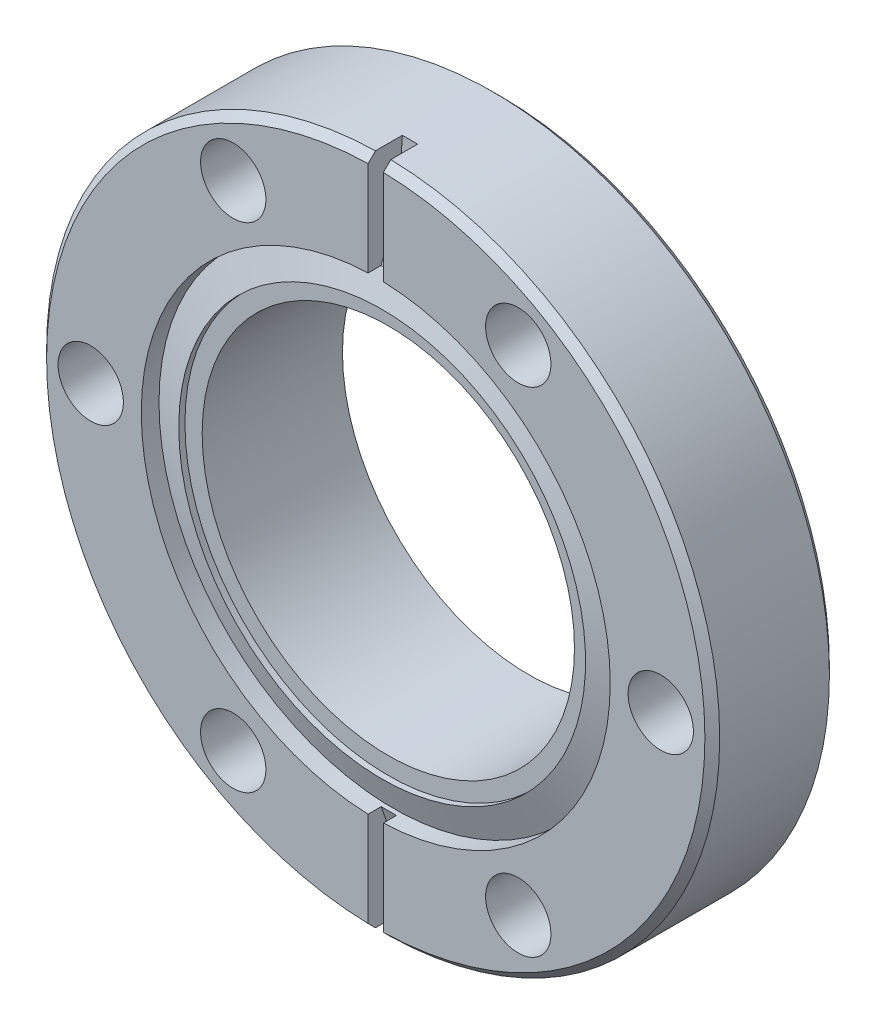
ISO-10303-21;
HEADER;
FILE_DESCRIPTION(('STEP AP214'),'2;1');
FILE_NAME('part.step','',(''),(''),'','','');
FILE_SCHEMA(('AUTOMOTIVE_DESIGN { 1 0 10303 214 1 1 1 1 }'));
ENDSEC;
DATA;
#1=APPLICATION_CONTEXT('core data for automotive mechanical design processes');
#2=APPLICATION_PROTOCOL_DEFINITION('international standard','automotive_design',2000,#1);
#3=PRODUCT_CONTEXT('',#1,'mechanical');
#4=PRODUCT('Part','Part','',(#3));
#5=PRODUCT_RELATED_PRODUCT_CATEGORY('part','',(#4));
#6=PRODUCT_DEFINITION_FORMATION('','',#4);
#7=PRODUCT_DEFINITION_CONTEXT('part definition',#1,'design');
#8=PRODUCT_DEFINITION('design','',#6,#7);
#9=PRODUCT_DEFINITION_SHAPE('','',#8);
#10=(LENGTH_UNIT() NAMED_UNIT(*) SI_UNIT(.MILLI.,.METRE.));
#11=(NAMED_UNIT(*) PLANE_ANGLE_UNIT() SI_UNIT($,.RADIAN.));
#12=(NAMED_UNIT(*) SI_UNIT($,.STERADIAN.) SOLID_ANGLE_UNIT());
#13=UNCERTAINTY_MEASURE_WITH_UNIT(LENGTH_MEASURE(1.E-05),#10,'distance_accuracy_value','');
#14=(GEOMETRIC_REPRESENTATION_CONTEXT(3) GLOBAL_UNCERTAINTY_ASSIGNED_CONTEXT((#13)) GLOBAL_UNIT_ASSIGNED_CONTEXT((#10,
#11,#12)) REPRESENTATION_CONTEXT('',''));
#15=CARTESIAN_POINT('',(0.,0.,0.));
#16=DIRECTION('',(0.,0.,1.));
#17=DIRECTION('',(1.,0.,0.));
#18=AXIS2_PLACEMENT_3D('',#15,#16,#17);
#19=CARTESIAN_POINT('',(0.,20.955,14.4526));
#20=DIRECTION('',(0.,0.,-1.));
#21=DIRECTION('',(-1.,0.,0.));
#22=AXIS2_PLACEMENT_3D('',#19,#20,#21);
#23=PLANE('',#22);
#24=CARTESIAN_POINT('',(0.,0.,14.4526));
#25=DIRECTION('',(0.,0.,-1.));
#26=DIRECTION('',(-1.,0.,0.));
#27=AXIS2_PLACEMENT_3D('',#24,#25,#26);
#28=CIRCLE('',#27,20.955);
#29=CARTESIAN_POINT('',(-20.955,0.,14.4526));
#30=VERTEX_POINT('',#29);
#31=EDGE_CURVE('E19',#30,#30,#28,.F.);
#32=ORIENTED_EDGE('',*,*,#31,.T.);
#33=EDGE_LOOP('',(#32));
#34=FACE_BOUND('',#33,.T.);
#35=CARTESIAN_POINT('',(0.,0.,14.4526));
#36=DIRECTION('',(0.,0.,-1.));
#37=DIRECTION('',(-1.,0.,0.));
#38=AXIS2_PLACEMENT_3D('',#35,#36,#37);
#39=CIRCLE('',#38,19.177);
#40=CARTESIAN_POINT('',(-19.177,0.,14.4526));
#41=VERTEX_POINT('',#40);
#42=EDGE_CURVE('E100',#41,#41,#39,.T.);
#43=ORIENTED_EDGE('',*,*,#42,.T.);
#44=EDGE_LOOP('',(#43));
#45=FACE_BOUND('',#44,.T.);
#46=ADVANCED_FACE('F16',(#34,#45),#23,.F.);
#47=CARTESIAN_POINT('',(0.,0.,0.));
#48=DIRECTION('',(0.,0.,-1.));
#49=DIRECTION('',(-1.,0.,0.));
#50=AXIS2_PLACEMENT_3D('',#47,#48,#49);
#51=CYLINDRICAL_SURFACE('',#50,20.955);
#52=ORIENTED_EDGE('',*,*,#31,.F.);
#53=EDGE_LOOP('',(#52));
#54=FACE_BOUND('',#53,.T.);
#55=CARTESIAN_POINT('',(0.,0.,15.0876));
#56=DIRECTION('',(0.,0.,-1.));
#57=DIRECTION('',(-1.,0.,0.));
#58=AXIS2_PLACEMENT_3D('',#55,#56,#57);
#59=CIRCLE('',#58,20.955);
#60=CARTESIAN_POINT('',(-20.955,0.,15.0876));
#61=VERTEX_POINT('',#60);
#62=EDGE_CURVE('E149',#61,#61,#59,.T.);
#63=ORIENTED_EDGE('',*,*,#62,.F.);
#64=EDGE_LOOP('',(#63));
#65=FACE_BOUND('',#64,.T.);
#66=ADVANCED_FACE('F298',(#54,#65),#51,.F.);
#67=CARTESIAN_POINT('',(0.,0.,15.748));
#68=DIRECTION('',(0.,0.,-1.));
#69=DIRECTION('',(-1.,0.,0.));
#70=AXIS2_PLACEMENT_3D('',#67,#68,#69);
#71=CYLINDRICAL_SURFACE('',#70,19.177);
#72=ORIENTED_EDGE('',*,*,#42,.F.);
#73=EDGE_LOOP('',(#72));
#74=FACE_BOUND('',#73,.T.);
#75=CARTESIAN_POINT('',(0.,0.,0.));
#76=DIRECTION('',(0.,0.,-1.));
#77=DIRECTION('',(-1.,0.,0.));
#78=AXIS2_PLACEMENT_3D('',#75,#76,#77);
#79=CIRCLE('',#78,19.177);
#80=CARTESIAN_POINT('',(-19.177,0.,0.));
#81=VERTEX_POINT('',#80);
#82=EDGE_CURVE('E151',#81,#81,#79,.T.);
#83=ORIENTED_EDGE('',*,*,#82,.T.);
#84=EDGE_LOOP('',(#83));
#85=FACE_BOUND('',#84,.T.);
#86=ADVANCED_FACE('F301',(#74,#85),#71,.F.);
#87=CARTESIAN_POINT('',(-0.7874,-35.7647503648526,43.9485551970518));
#88=DIRECTION('',(1.,0.,0.));
#89=DIRECTION('',(0.,0.,-1.));
#90=AXIS2_PLACEMENT_3D('',#87,#88,#89);
#91=CYLINDRICAL_SURFACE('',#90,31.75);
#92=CARTESIAN_POINT('',(0.787400000000003,-35.7647503648526,43.9485551970518));
#93=DIRECTION('',(1.,0.,0.));
#94=DIRECTION('',(0.,0.,-1.));
#95=AXIS2_PLACEMENT_3D('',#92,#93,#94);
#96=CIRCLE('',#95,31.75);
#97=CARTESIAN_POINT('',(0.7874,-34.662057674639,12.2177094971504));
#98=VERTEX_POINT('',#97);
#99=CARTESIAN_POINT('',(0.787400000000006,-24.1425630453769,14.4021973519464));
#100=VERTEX_POINT('',#99);
#101=EDGE_CURVE('E103',#98,#100,#96,.T.);
#102=ORIENTED_EDGE('',*,*,#101,.T.);
#103=CARTESIAN_POINT('',(-0.787399999999995,-24.1425630453769,14.4021973519464));
#104=CARTESIAN_POINT('',(-0.524933333333327,-24.1511210151256,14.3988331839951));
#105=CARTESIAN_POINT('',(-0.26246666666666,-24.1554,14.3971511000194));
#106=CARTESIAN_POINT('',(0.262466666666674,-24.1554,14.3971511000194));
#107=CARTESIAN_POINT('',(0.524933333333342,-24.1511210151256,14.3988331839951));
#108=CARTESIAN_POINT('',(0.787400000000009,-24.1425630453769,14.4021973519464));
#109=B_SPLINE_CURVE_WITH_KNOTS('',3,(#103,#104,#105,#106,#107,#108),.UNSPECIFIED.,.F.,.F.,(4,2,
4),(0.,0.787520801034809,1.57504160206962),.UNSPECIFIED.);
#110=CARTESIAN_POINT('',(-0.787399999999997,-24.1425630453769,14.4021973519464));
#111=VERTEX_POINT('',#110);
#112=EDGE_CURVE('E91',#111,#100,#109,.T.);
#113=ORIENTED_EDGE('',*,*,#112,.F.);
#114=CARTESIAN_POINT('',(-0.787399999999999,-35.7647503648526,43.9485551970518));
#115=DIRECTION('',(1.,0.,0.));
#116=DIRECTION('',(0.,0.,-1.));
#117=AXIS2_PLACEMENT_3D('',#114,#115,#116);
#118=CIRCLE('',#117,31.75);
#119=CARTESIAN_POINT('',(-0.787399999999995,-34.662057674639,12.2177094971504));
#120=VERTEX_POINT('',#119);
#121=EDGE_CURVE('E393',#120,#111,#118,.T.);
#122=ORIENTED_EDGE('',*,*,#121,.F.);
#123=CARTESIAN_POINT('',(0.787399999999997,-34.662057674639,12.2177094971504));
#124=CARTESIAN_POINT('',(0.524933333333332,-34.6680192248797,12.2175031657168));
#125=CARTESIAN_POINT('',(0.262466666666668,-34.671,12.2174));
#126=CARTESIAN_POINT('',(-0.262466666666661,-34.671,12.2174));
#127=CARTESIAN_POINT('',(-0.524933333333326,-34.6680192248797,12.2175031657168));
#128=CARTESIAN_POINT('',(-0.78739999999999,-34.662057674639,12.2177094971504));
#129=B_SPLINE_CURVE_WITH_KNOTS('',3,(#123,#124,#125,#126,#127,#128),.UNSPECIFIED.,.F.,.F.,(4,2,
4),(0.,0.787450837177368,1.57490167435474),.UNSPECIFIED.);
#130=EDGE_CURVE('E99',#98,#120,#129,.T.);
#131=ORIENTED_EDGE('',*,*,#130,.F.);
#132=EDGE_LOOP('',(#102,#113,#122,#131));
#133=FACE_BOUND('',#132,.T.);
#134=ADVANCED_FACE('F104',(#133),#91,.F.);
#135=CARTESIAN_POINT('',(-0.787399999999999,35.7647503648525,43.9485551970518));
#136=DIRECTION('',(1.,0.,0.));
#137=DIRECTION('',(0.,0.,-1.));
#138=AXIS2_PLACEMENT_3D('',#135,#136,#137);
#139=CYLINDRICAL_SURFACE('',#138,31.75);
#140=CARTESIAN_POINT('',(0.7874,24.1425630453769,14.4021973519464));
#141=CARTESIAN_POINT('',(0.524933333333334,24.1511210151256,14.3988331839951));
#142=CARTESIAN_POINT('',(0.262466666666667,24.1554,14.3971511000194));
#143=CARTESIAN_POINT('',(-0.262466666666666,24.1554,14.3971511000194));
#144=CARTESIAN_POINT('',(-0.524933333333332,24.1511210151256,14.3988331839951));
#145=CARTESIAN_POINT('',(-0.787399999999999,24.1425630453769,14.4021973519464));
#146=B_SPLINE_CURVE_WITH_KNOTS('',3,(#140,#141,#142,#143,#144,#145),.UNSPECIFIED.,.F.,.F.,(4,2,
4),(0.,0.787520801034807,1.57504160206961),.UNSPECIFIED.);
#147=CARTESIAN_POINT('',(0.7874,24.1425630453769,14.4021973519464));
#148=VERTEX_POINT('',#147);
#149=CARTESIAN_POINT('',(-0.787399999999998,24.1425630453769,14.4021973519464));
#150=VERTEX_POINT('',#149);
#151=EDGE_CURVE('E152',#148,#150,#146,.T.);
#152=ORIENTED_EDGE('',*,*,#151,.F.);
#153=CARTESIAN_POINT('',(0.7874,35.7647503648525,43.9485551970518));
#154=DIRECTION('',(1.,0.,0.));
#155=DIRECTION('',(0.,0.,-1.));
#156=AXIS2_PLACEMENT_3D('',#153,#154,#155);
#157=CIRCLE('',#156,31.75);
#158=CARTESIAN_POINT('',(0.7874,34.662057674639,12.2177094971504));
#159=VERTEX_POINT('',#158);
#160=EDGE_CURVE('E125',#148,#159,#157,.T.);
#161=ORIENTED_EDGE('',*,*,#160,.T.);
#162=CARTESIAN_POINT('',(-0.787399999999999,34.662057674639,12.2177094971504));
#163=CARTESIAN_POINT('',(-0.524933333333332,34.6680192248797,12.2175031657168));
#164=CARTESIAN_POINT('',(-0.262466666666666,34.671,12.2174));
#165=CARTESIAN_POINT('',(0.262466666666667,34.671,12.2174));
#166=CARTESIAN_POINT('',(0.524933333333334,34.6680192248797,12.2175031657168));
#167=CARTESIAN_POINT('',(0.787400000000001,34.662057674639,12.2177094971504));
#168=B_SPLINE_CURVE_WITH_KNOTS('',3,(#162,#163,#164,#165,#166,#167),.UNSPECIFIED.,.F.,.F.,(4,2,
4),(0.,0.787450837177374,1.57490167435475),.UNSPECIFIED.);
#169=CARTESIAN_POINT('',(-0.787399999999999,34.662057674639,12.2177094971504));
#170=VERTEX_POINT('',#169);
#171=EDGE_CURVE('E267',#170,#159,#168,.T.);
#172=ORIENTED_EDGE('',*,*,#171,.F.);
#173=CARTESIAN_POINT('',(-0.787399999999999,35.7647503648525,43.9485551970518));
#174=DIRECTION('',(1.,0.,0.));
#175=DIRECTION('',(0.,0.,-1.));
#176=AXIS2_PLACEMENT_3D('',#173,#174,#175);
#177=CIRCLE('',#176,31.75);
#178=EDGE_CURVE('E109',#150,#170,#177,.T.);
#179=ORIENTED_EDGE('',*,*,#178,.F.);
#180=EDGE_LOOP('',(#152,#161,#172,#179));
#181=FACE_BOUND('',#180,.T.);
#182=ADVANCED_FACE('F252',(#181),#139,.F.);
#183=CARTESIAN_POINT('',(0.,0.,13.9227496622544));
#184=DIRECTION('',(0.,0.,-1.));
#185=DIRECTION('',(-1.,0.,0.));
#186=AXIS2_PLACEMENT_3D('',#183,#184,#185);
#187=CONICAL_SURFACE('',#186,24.1554,1.22173047639603);
#188=ORIENTED_EDGE('',*,*,#62,.T.);
#189=EDGE_LOOP('',(#188));
#190=FACE_BOUND('',#189,.T.);
#191=CARTESIAN_POINT('',(0.,0.,13.9227496622544));
#192=DIRECTION('',(0.,0.,-1.));
#193=DIRECTION('',(-1.,0.,0.));
#194=AXIS2_PLACEMENT_3D('',#191,#192,#193);
#195=CIRCLE('',#194,24.1554);
#196=CARTESIAN_POINT('',(-24.1554,0.,13.9227496622544));
#197=VERTEX_POINT('',#196);
#198=EDGE_CURVE('E117',#197,#197,#195,.F.);
#199=ORIENTED_EDGE('',*,*,#198,.T.);
#200=EDGE_LOOP('',(#199));
#201=FACE_BOUND('',#200,.T.);
#202=ADVANCED_FACE('F248',(#190,#201),#187,.T.);
#203=CARTESIAN_POINT('',(0.,0.,0.));
#204=DIRECTION('',(0.,0.,1.));
#205=DIRECTION('',(1.,0.,0.));
#206=AXIS2_PLACEMENT_3D('',#203,#204,#205);
#207=PLANE('',#206);
#208=ORIENTED_EDGE('',*,*,#82,.F.);
#209=EDGE_LOOP('',(#208));
#210=FACE_BOUND('',#209,.T.);
#211=CARTESIAN_POINT('',(0.,0.,0.));
#212=DIRECTION('',(0.,0.,1.));
#213=DIRECTION('',(1.,0.,0.));
#214=AXIS2_PLACEMENT_3D('',#211,#212,#213);
#215=CIRCLE('',#214,25.2476);
#216=CARTESIAN_POINT('',(25.2476,0.,0.));
#217=VERTEX_POINT('',#216);
#218=EDGE_CURVE('E129',#217,#217,#215,.T.);
#219=ORIENTED_EDGE('',*,*,#218,.F.);
#220=EDGE_LOOP('',(#219));
#221=FACE_BOUND('',#220,.T.);
#222=ADVANCED_FACE('F244',(#210,#221),#207,.F.);
#223=CARTESIAN_POINT('',(0.,0.,14.986));
#224=DIRECTION('',(0.,0.,-1.));
#225=DIRECTION('',(-1.,0.,0.));
#226=AXIS2_PLACEMENT_3D('',#223,#224,#225);
#227=CONICAL_SURFACE('',#226,34.671,0.78539816339745);
#228=CARTESIAN_POINT('',(0.,0.,14.986));
#229=DIRECTION('',(0.,0.,-1.));
#230=DIRECTION('',(-1.,0.,0.));
#231=AXIS2_PLACEMENT_3D('',#228,#229,#230);
#232=CIRCLE('',#231,34.671);
#233=CARTESIAN_POINT('',(-0.787399999999995,-34.662057674639,14.986));
#234=VERTEX_POINT('',#233);
#235=CARTESIAN_POINT('',(-0.787399999999998,34.662057674639,14.986));
#236=VERTEX_POINT('',#235);
#237=EDGE_CURVE('E133',#234,#236,#232,.T.);
#238=ORIENTED_EDGE('',*,*,#237,.F.);
#239=DIRECTION('',(0.,-0.707200025081546,-0.707013524994154));
#240=VECTOR('',#239,1.);
#241=CARTESIAN_POINT('',(-0.7874,-33.8998566699036,15.748));
#242=LINE('',#241,#240);
#243=CARTESIAN_POINT('',(-0.7874,-33.8998566699036,15.748));
#244=VERTEX_POINT('',#243);
#245=EDGE_CURVE('E394',#244,#234,#242,.T.);
#246=ORIENTED_EDGE('',*,*,#245,.F.);
#247=CARTESIAN_POINT('',(0.,0.,15.748));
#248=DIRECTION('',(0.,0.,-1.));
#249=DIRECTION('',(-1.,0.,0.));
#250=AXIS2_PLACEMENT_3D('',#247,#248,#249);
#251=CIRCLE('',#250,33.909);
#252=CARTESIAN_POINT('',(-0.7874,33.8998566699034,15.748));
#253=VERTEX_POINT('',#252);
#254=EDGE_CURVE('E204',#253,#244,#251,.F.);
#255=ORIENTED_EDGE('',*,*,#254,.F.);
#256=DIRECTION('',(0.,-0.707200025081585,0.707013524994116));
#257=VECTOR('',#256,1.);
#258=CARTESIAN_POINT('',(-0.787399999999999,34.662057674639,14.986));
#259=LINE('',#258,#257);
#260=EDGE_CURVE('E396',#236,#253,#259,.T.);
#261=ORIENTED_EDGE('',*,*,#260,.F.);
#262=EDGE_LOOP('',(#238,#246,#255,#261));
#263=FACE_BOUND('',#262,.T.);
#264=ADVANCED_FACE('F240',(#263),#227,.T.);
#265=CARTESIAN_POINT('',(-0.7874,-35.7647503648526,43.9485551970518));
#266=DIRECTION('',(1.,0.,0.));
#267=DIRECTION('',(0.,0.,-1.));
#268=AXIS2_PLACEMENT_3D('',#265,#266,#267);
#269=PLANE('',#268);
#270=DIRECTION('',(0.,1.,0.));
#271=VECTOR('',#270,1.);
#272=CARTESIAN_POINT('',(-0.7874,0.,15.748));
#273=LINE('',#272,#271);
#274=CARTESIAN_POINT('',(-0.787399999999995,-24.1425630453769,15.748));
#275=VERTEX_POINT('',#274);
#276=EDGE_CURVE('E203',#244,#275,#273,.T.);
#277=ORIENTED_EDGE('',*,*,#276,.F.);
#278=ORIENTED_EDGE('',*,*,#245,.T.);
#279=DIRECTION('',(0.,0.,-1.));
#280=VECTOR('',#279,1.);
#281=CARTESIAN_POINT('',(-0.787399999999981,-34.662057674639,15.748));
#282=LINE('',#281,#280);
#283=EDGE_CURVE('E134',#120,#234,#282,.F.);
#284=ORIENTED_EDGE('',*,*,#283,.F.);
#285=ORIENTED_EDGE('',*,*,#121,.T.);
#286=DIRECTION('',(0.,0.,-1.));
#287=VECTOR('',#286,1.);
#288=CARTESIAN_POINT('',(-0.787399999999991,-24.1425630453769,0.));
#289=LINE('',#288,#287);
#290=EDGE_CURVE('E98',#111,#275,#289,.F.);
#291=ORIENTED_EDGE('',*,*,#290,.T.);
#292=EDGE_LOOP('',(#277,#278,#284,#285,#291));
#293=FACE_BOUND('',#292,.T.);
#294=ADVANCED_FACE('F236',(#293),#269,.T.);
#295=CARTESIAN_POINT('',(-0.787399999999999,35.7647503648525,43.9485551970518));
#296=DIRECTION('',(1.,0.,0.));
#297=DIRECTION('',(0.,0.,-1.));
#298=AXIS2_PLACEMENT_3D('',#295,#296,#297);
#299=PLANE('',#298);
#300=DIRECTION('',(0.,0.,-1.));
#301=VECTOR('',#300,1.);
#302=CARTESIAN_POINT('',(-0.787400000000002,24.1425630453769,0.));
#303=LINE('',#302,#301);
#304=CARTESIAN_POINT('',(-0.787400000000001,24.1425630453769,15.748));
#305=VERTEX_POINT('',#304);
#306=EDGE_CURVE('E119',#305,#150,#303,.T.);
#307=ORIENTED_EDGE('',*,*,#306,.T.);
#308=ORIENTED_EDGE('',*,*,#178,.T.);
#309=DIRECTION('',(0.,0.,-1.));
#310=VECTOR('',#309,1.);
#311=CARTESIAN_POINT('',(-0.787399999999997,34.662057674639,15.748));
#312=LINE('',#311,#310);
#313=EDGE_CURVE('E130',#236,#170,#312,.T.);
#314=ORIENTED_EDGE('',*,*,#313,.F.);
#315=ORIENTED_EDGE('',*,*,#260,.T.);
#316=DIRECTION('',(0.,1.,0.));
#317=VECTOR('',#316,1.);
#318=CARTESIAN_POINT('',(-0.7874,0.,15.748));
#319=LINE('',#318,#317);
#320=EDGE_CURVE('E202',#305,#253,#319,.T.);
#321=ORIENTED_EDGE('',*,*,#320,.F.);
#322=EDGE_LOOP('',(#307,#308,#314,#315,#321));
#323=FACE_BOUND('',#322,.T.);
#324=ADVANCED_FACE('F233',(#323),#299,.T.);
#325=CARTESIAN_POINT('',(0.7874,-35.7647503648526,43.9485551970518));
#326=DIRECTION('',(1.,0.,0.));
#327=DIRECTION('',(0.,0.,-1.));
#328=AXIS2_PLACEMENT_3D('',#325,#326,#327);
#329=PLANE('',#328);
#330=DIRECTION('',(0.,1.,0.));
#331=VECTOR('',#330,1.);
#332=CARTESIAN_POINT('',(0.787400000000001,0.,15.748));
#333=LINE('',#332,#331);
#334=CARTESIAN_POINT('',(0.7874,-24.1425630453769,15.748));
#335=VERTEX_POINT('',#334);
#336=CARTESIAN_POINT('',(0.787400000000001,-33.8998566699035,15.748));
#337=VERTEX_POINT('',#336);
#338=EDGE_CURVE('E114',#335,#337,#333,.F.);
#339=ORIENTED_EDGE('',*,*,#338,.F.);
#340=DIRECTION('',(0.,0.,-1.));
#341=VECTOR('',#340,1.);
#342=CARTESIAN_POINT('',(0.787399999999999,-24.1425630453769,0.));
#343=LINE('',#342,#341);
#344=EDGE_CURVE('E96',#335,#100,#343,.T.);
#345=ORIENTED_EDGE('',*,*,#344,.T.);
#346=ORIENTED_EDGE('',*,*,#101,.F.);
#347=DIRECTION('',(0.,0.,-1.));
#348=VECTOR('',#347,1.);
#349=CARTESIAN_POINT('',(0.787399999999993,-34.662057674639,15.748));
#350=LINE('',#349,#348);
#351=CARTESIAN_POINT('',(0.787399999999997,-34.662057674639,14.986));
#352=VERTEX_POINT('',#351);
#353=EDGE_CURVE('E145',#352,#98,#350,.T.);
#354=ORIENTED_EDGE('',*,*,#353,.F.);
#355=CARTESIAN_POINT('',(0.7874,-33.8998566699035,15.748));
#356=CARTESIAN_POINT('',(0.7874,-34.0268905429728,15.6210003723782));
#357=CARTESIAN_POINT('',(0.7874,-34.1539242299021,15.4940005585674));
#358=CARTESIAN_POINT('',(0.7874,-34.4079912314806,15.2400005585674));
#359=CARTESIAN_POINT('',(0.7874,-34.5350245461298,15.1130003723782));
#360=CARTESIAN_POINT('',(0.7874,-34.662057674639,14.986));
#361=B_SPLINE_CURVE_WITH_KNOTS('',3,(#355,#356,#357,#358,#359,#360),.UNSPECIFIED.,.F.,.F.,(4,2,
4),(0.,0.538886437856426,1.07777287571282),.UNSPECIFIED.);
#362=EDGE_CURVE('E108',#337,#352,#361,.T.);
#363=ORIENTED_EDGE('',*,*,#362,.F.);
#364=EDGE_LOOP('',(#339,#345,#346,#354,#363));
#365=FACE_BOUND('',#364,.T.);
#366=ADVANCED_FACE('F112',(#365),#329,.F.);
#367=CARTESIAN_POINT('',(0.,0.,14.986));
#368=DIRECTION('',(0.,0.,-1.));
#369=DIRECTION('',(-1.,0.,0.));
#370=AXIS2_PLACEMENT_3D('',#367,#368,#369);
#371=CONICAL_SURFACE('',#370,34.671,0.785398163397452);
#372=CARTESIAN_POINT('',(0.787400000000001,34.662057674639,14.986));
#373=CARTESIAN_POINT('',(0.787400000000001,34.5350245461298,15.1130003723783));
#374=CARTESIAN_POINT('',(0.787400000000001,34.4079912314806,15.2400005585674));
#375=CARTESIAN_POINT('',(0.787400000000001,34.1539242299021,15.4940005585674));
#376=CARTESIAN_POINT('',(0.787400000000001,34.0268905429728,15.6210003723783));
#377=CARTESIAN_POINT('',(0.787400000000001,33.8998566699035,15.748));
#378=B_SPLINE_CURVE_WITH_KNOTS('',3,(#372,#373,#374,#375,#376,#377),.UNSPECIFIED.,.F.,.F.,(4,2,
4),(0.,0.538886437856403,1.07777287571284),.UNSPECIFIED.);
#379=CARTESIAN_POINT('',(0.787400000000001,34.662057674639,14.986));
#380=VERTEX_POINT('',#379);
#381=CARTESIAN_POINT('',(0.787400000000001,33.8998566699035,15.748));
#382=VERTEX_POINT('',#381);
#383=EDGE_CURVE('E211',#380,#382,#378,.T.);
#384=ORIENTED_EDGE('',*,*,#383,.T.);
#385=CARTESIAN_POINT('',(0.,0.,15.748));
#386=DIRECTION('',(0.,0.,-1.));
#387=DIRECTION('',(-1.,0.,0.));
#388=AXIS2_PLACEMENT_3D('',#385,#386,#387);
#389=CIRCLE('',#388,33.909);
#390=EDGE_CURVE('E196',#337,#382,#389,.F.);
#391=ORIENTED_EDGE('',*,*,#390,.F.);
#392=ORIENTED_EDGE('',*,*,#362,.T.);
#393=CARTESIAN_POINT('',(0.,0.,14.986));
#394=DIRECTION('',(0.,0.,-1.));
#395=DIRECTION('',(-1.,0.,0.));
#396=AXIS2_PLACEMENT_3D('',#393,#394,#395);
#397=CIRCLE('',#396,34.671);
#398=EDGE_CURVE('E131',#380,#352,#397,.T.);
#399=ORIENTED_EDGE('',*,*,#398,.F.);
#400=EDGE_LOOP('',(#384,#391,#392,#399));
#401=FACE_BOUND('',#400,.T.);
#402=ADVANCED_FACE('F225',(#401),#371,.T.);
#403=CARTESIAN_POINT('',(0.787400000000001,35.7647503648525,43.9485551970518));
#404=DIRECTION('',(1.,0.,0.));
#405=DIRECTION('',(0.,0.,-1.));
#406=AXIS2_PLACEMENT_3D('',#403,#404,#405);
#407=PLANE('',#406);
#408=DIRECTION('',(0.,0.,-1.));
#409=VECTOR('',#408,1.);
#410=CARTESIAN_POINT('',(0.787399999999999,24.1425630453769,0.));
#411=LINE('',#410,#409);
#412=CARTESIAN_POINT('',(0.7874,24.1425630453769,15.748));
#413=VERTEX_POINT('',#412);
#414=EDGE_CURVE('E115',#148,#413,#411,.F.);
#415=ORIENTED_EDGE('',*,*,#414,.T.);
#416=DIRECTION('',(0.,1.,0.));
#417=VECTOR('',#416,1.);
#418=CARTESIAN_POINT('',(0.787400000000001,0.,15.748));
#419=LINE('',#418,#417);
#420=EDGE_CURVE('E195',#382,#413,#419,.F.);
#421=ORIENTED_EDGE('',*,*,#420,.F.);
#422=ORIENTED_EDGE('',*,*,#383,.F.);
#423=DIRECTION('',(0.,0.,-1.));
#424=VECTOR('',#423,1.);
#425=CARTESIAN_POINT('',(0.7874,34.662057674639,15.748));
#426=LINE('',#425,#424);
#427=EDGE_CURVE('E126',#159,#380,#426,.F.);
#428=ORIENTED_EDGE('',*,*,#427,.F.);
#429=ORIENTED_EDGE('',*,*,#160,.F.);
#430=EDGE_LOOP('',(#415,#421,#422,#428,#429));
#431=FACE_BOUND('',#430,.T.);
#432=ADVANCED_FACE('F222',(#431),#407,.F.);
#433=CARTESIAN_POINT('',(0.,0.,0.));
#434=DIRECTION('',(0.,0.,-1.));
#435=DIRECTION('',(-1.,0.,0.));
#436=AXIS2_PLACEMENT_3D('',#433,#434,#435);
#437=CYLINDRICAL_SURFACE('',#436,24.1554);
#438=ORIENTED_EDGE('',*,*,#198,.F.);
#439=EDGE_LOOP('',(#438));
#440=FACE_BOUND('',#439,.T.);
#441=CARTESIAN_POINT('',(0.,0.,15.748));
#442=DIRECTION('',(0.,0.,-1.));
#443=DIRECTION('',(-1.,0.,0.));
#444=AXIS2_PLACEMENT_3D('',#441,#442,#443);
#445=CIRCLE('',#444,24.1554);
#446=EDGE_CURVE('E34',#413,#335,#445,.T.);
#447=ORIENTED_EDGE('',*,*,#446,.F.);
#448=ORIENTED_EDGE('',*,*,#414,.F.);
#449=ORIENTED_EDGE('',*,*,#151,.T.);
#450=ORIENTED_EDGE('',*,*,#306,.F.);
#451=CARTESIAN_POINT('',(0.,0.,15.748));
#452=DIRECTION('',(0.,0.,-1.));
#453=DIRECTION('',(-1.,0.,0.));
#454=AXIS2_PLACEMENT_3D('',#451,#452,#453);
#455=CIRCLE('',#454,24.1554);
#456=EDGE_CURVE('E199',#275,#305,#455,.T.);
#457=ORIENTED_EDGE('',*,*,#456,.F.);
#458=ORIENTED_EDGE('',*,*,#290,.F.);
#459=ORIENTED_EDGE('',*,*,#112,.T.);
#460=ORIENTED_EDGE('',*,*,#344,.F.);
#461=EDGE_LOOP('',(#447,#448,#449,#450,#457,#458,#459,#460));
#462=FACE_BOUND('',#461,.T.);
#463=ADVANCED_FACE('F94',(#440,#462),#437,.F.);
#464=CARTESIAN_POINT('',(0.,0.,15.748));
#465=DIRECTION('',(0.,0.,-1.));
#466=DIRECTION('',(-1.,0.,0.));
#467=AXIS2_PLACEMENT_3D('',#464,#465,#466);
#468=CYLINDRICAL_SURFACE('',#467,34.671);
#469=CARTESIAN_POINT('',(0.,0.,3.68299999999999));
#470=DIRECTION('',(0.,0.,1.));
#471=DIRECTION('',(1.,0.,0.));
#472=AXIS2_PLACEMENT_3D('',#469,#470,#471);
#473=CIRCLE('',#472,34.671);
#474=CARTESIAN_POINT('',(34.671,0.,3.68299999999999));
#475=VERTEX_POINT('',#474);
#476=EDGE_CURVE('E193',#475,#475,#473,.F.);
#477=ORIENTED_EDGE('',*,*,#476,.F.);
#478=EDGE_LOOP('',(#477));
#479=FACE_BOUND('',#478,.T.);
#480=ORIENTED_EDGE('',*,*,#171,.T.);
#481=ORIENTED_EDGE('',*,*,#427,.T.);
#482=ORIENTED_EDGE('',*,*,#398,.T.);
#483=ORIENTED_EDGE('',*,*,#353,.T.);
#484=ORIENTED_EDGE('',*,*,#130,.T.);
#485=ORIENTED_EDGE('',*,*,#283,.T.);
#486=ORIENTED_EDGE('',*,*,#237,.T.);
#487=ORIENTED_EDGE('',*,*,#313,.T.);
#488=EDGE_LOOP('',(#480,#481,#482,#483,#484,#485,#486,#487));
#489=FACE_BOUND('',#488,.T.);
#490=ADVANCED_FACE('F276',(#479,#489),#468,.T.);
#491=CARTESIAN_POINT('',(0.,0.,0.126999999999998));
#492=DIRECTION('',(0.,0.,1.));
#493=DIRECTION('',(1.,0.,0.));
#494=AXIS2_PLACEMENT_3D('',#491,#492,#493);
#495=CONICAL_SURFACE('',#494,25.3746,0.785398163397448);
#496=ORIENTED_EDGE('',*,*,#218,.T.);
#497=EDGE_LOOP('',(#496));
#498=FACE_BOUND('',#497,.T.);
#499=CARTESIAN_POINT('',(0.,0.,0.126999999999999));
#500=DIRECTION('',(0.,0.,1.));
#501=DIRECTION('',(1.,0.,0.));
#502=AXIS2_PLACEMENT_3D('',#499,#500,#501);
#503=CIRCLE('',#502,25.3746);
#504=CARTESIAN_POINT('',(25.3746,0.,0.126999999999999));
#505=VERTEX_POINT('',#504);
#506=EDGE_CURVE('E183',#505,#505,#503,.T.);
#507=ORIENTED_EDGE('',*,*,#506,.F.);
#508=EDGE_LOOP('',(#507));
#509=FACE_BOUND('',#508,.T.);
#510=ADVANCED_FACE('F280',(#498,#509),#495,.T.);
#511=CARTESIAN_POINT('',(0.,0.,15.748));
#512=DIRECTION('',(0.,0.,1.));
#513=DIRECTION('',(1.,0.,0.));
#514=AXIS2_PLACEMENT_3D('',#511,#512,#513);
#515=PLANE('',#514);
#516=ORIENTED_EDGE('',*,*,#456,.T.);
#517=ORIENTED_EDGE('',*,*,#320,.T.);
#518=ORIENTED_EDGE('',*,*,#254,.T.);
#519=ORIENTED_EDGE('',*,*,#276,.T.);
#520=EDGE_LOOP('',(#516,#517,#518,#519));
#521=FACE_BOUND('',#520,.T.);
#522=CARTESIAN_POINT('',(-14.6811999999997,25.4285843160803,15.748));
#523=DIRECTION('',(0.,0.,1.));
#524=DIRECTION('',(1.,0.,0.));
#525=AXIS2_PLACEMENT_3D('',#522,#523,#524);
#526=CIRCLE('',#525,3.3655);
#527=CARTESIAN_POINT('',(-11.3156999999997,25.4285843160803,15.748));
#528=VERTEX_POINT('',#527);
#529=EDGE_CURVE('E184',#528,#528,#526,.F.);
#530=ORIENTED_EDGE('',*,*,#529,.T.);
#531=EDGE_LOOP('',(#530));
#532=FACE_BOUND('',#531,.T.);
#533=CARTESIAN_POINT('',(-29.3624,2.08166817117217E-13,15.748));
#534=DIRECTION('',(0.,0.,1.));
#535=DIRECTION('',(1.,0.,0.));
#536=AXIS2_PLACEMENT_3D('',#533,#534,#535);
#537=CIRCLE('',#536,3.3655);
#538=CARTESIAN_POINT('',(-25.9969,2.08166817117217E-13,15.748));
#539=VERTEX_POINT('',#538);
#540=EDGE_CURVE('E177',#539,#539,#537,.F.);
#541=ORIENTED_EDGE('',*,*,#540,.T.);
#542=EDGE_LOOP('',(#541));
#543=FACE_BOUND('',#542,.T.);
#544=CARTESIAN_POINT('',(-14.6812000000001,-25.4285843160801,15.748));
#545=DIRECTION('',(0.,0.,1.));
#546=DIRECTION('',(1.,0.,0.));
#547=AXIS2_PLACEMENT_3D('',#544,#545,#546);
#548=CIRCLE('',#547,3.3655);
#549=CARTESIAN_POINT('',(-11.3157000000001,-25.4285843160801,15.748));
#550=VERTEX_POINT('',#549);
#551=EDGE_CURVE('E187',#550,#550,#548,.F.);
#552=ORIENTED_EDGE('',*,*,#551,.T.);
#553=EDGE_LOOP('',(#552));
#554=FACE_BOUND('',#553,.T.);
#555=ADVANCED_FACE('F353',(#521,#532,#543,#554),#515,.T.);
#556=CARTESIAN_POINT('',(0.,0.,15.748));
#557=DIRECTION('',(0.,0.,1.));
#558=DIRECTION('',(1.,0.,0.));
#559=AXIS2_PLACEMENT_3D('',#556,#557,#558);
#560=PLANE('',#559);
#561=CARTESIAN_POINT('',(14.6812000000003,25.42858431608,15.748));
#562=DIRECTION('',(0.,0.,1.));
#563=DIRECTION('',(1.,0.,0.));
#564=AXIS2_PLACEMENT_3D('',#561,#562,#563);
#565=CIRCLE('',#564,3.3655);
#566=CARTESIAN_POINT('',(18.0467000000003,25.42858431608,15.748));
#567=VERTEX_POINT('',#566);
#568=EDGE_CURVE('E180',#567,#567,#565,.F.);
#569=ORIENTED_EDGE('',*,*,#568,.T.);
#570=EDGE_LOOP('',(#569));
#571=FACE_BOUND('',#570,.T.);
#572=CARTESIAN_POINT('',(14.6812,-25.4285843160802,15.748));
#573=DIRECTION('',(0.,0.,1.));
#574=DIRECTION('',(1.,0.,0.));
#575=AXIS2_PLACEMENT_3D('',#572,#573,#574);
#576=CIRCLE('',#575,3.3655);
#577=CARTESIAN_POINT('',(18.0467,-25.4285843160802,15.748));
#578=VERTEX_POINT('',#577);
#579=EDGE_CURVE('E174',#578,#578,#576,.F.);
#580=ORIENTED_EDGE('',*,*,#579,.T.);
#581=EDGE_LOOP('',(#580));
#582=FACE_BOUND('',#581,.T.);
#583=CARTESIAN_POINT('',(29.3624,0.,15.748));
#584=DIRECTION('',(0.,0.,1.));
#585=DIRECTION('',(1.,0.,0.));
#586=AXIS2_PLACEMENT_3D('',#583,#584,#585);
#587=CIRCLE('',#586,3.3655);
#588=CARTESIAN_POINT('',(32.7279,0.,15.748));
#589=VERTEX_POINT('',#588);
#590=EDGE_CURVE('E190',#589,#589,#587,.F.);
#591=ORIENTED_EDGE('',*,*,#590,.T.);
#592=EDGE_LOOP('',(#591));
#593=FACE_BOUND('',#592,.T.);
#594=ORIENTED_EDGE('',*,*,#420,.T.);
#595=ORIENTED_EDGE('',*,*,#446,.T.);
#596=ORIENTED_EDGE('',*,*,#338,.T.);
#597=ORIENTED_EDGE('',*,*,#390,.T.);
#598=EDGE_LOOP('',(#594,#595,#596,#597));
#599=FACE_BOUND('',#598,.T.);
#600=ADVANCED_FACE('F350',(#571,#582,#593,#599),#560,.T.);
#601=CARTESIAN_POINT('',(0.,0.,3.68299999999999));
#602=DIRECTION('',(0.,0.,1.));
#603=DIRECTION('',(0.,-1.,0.));
#604=AXIS2_PLACEMENT_3D('',#601,#602,#603);
#605=CONICAL_SURFACE('',#604,34.671,0.785398163397452);
#606=ORIENTED_EDGE('',*,*,#476,.T.);
#607=EDGE_LOOP('',(#606));
#608=FACE_BOUND('',#607,.T.);
#609=CARTESIAN_POINT('',(0.,0.,2.921));
#610=DIRECTION('',(0.,0.,1.));
#611=DIRECTION('',(0.,-1.,0.));
#612=AXIS2_PLACEMENT_3D('',#609,#610,#611);
#613=CIRCLE('',#612,33.909);
#614=CARTESIAN_POINT('',(0.,-33.909,2.921));
#615=VERTEX_POINT('',#614);
#616=EDGE_CURVE('E171',#615,#615,#613,.F.);
#617=ORIENTED_EDGE('',*,*,#616,.F.);
#618=EDGE_LOOP('',(#617));
#619=FACE_BOUND('',#618,.T.);
#620=ADVANCED_FACE('F346',(#608,#619),#605,.T.);
#621=CARTESIAN_POINT('',(29.3624,0.,0.));
#622=DIRECTION('',(0.,0.,1.));
#623=DIRECTION('',(1.,0.,0.));
#624=AXIS2_PLACEMENT_3D('',#621,#622,#623);
#625=CYLINDRICAL_SURFACE('',#624,3.3655);
#626=ORIENTED_EDGE('',*,*,#590,.F.);
#627=EDGE_LOOP('',(#626));
#628=FACE_BOUND('',#627,.T.);
#629=CARTESIAN_POINT('',(29.3624,0.,2.921));
#630=DIRECTION('',(0.,0.,1.));
#631=DIRECTION('',(1.,0.,0.));
#632=AXIS2_PLACEMENT_3D('',#629,#630,#631);
#633=CIRCLE('',#632,3.3655);
#634=CARTESIAN_POINT('',(32.7279,0.,2.921));
#635=VERTEX_POINT('',#634);
#636=EDGE_CURVE('E168',#635,#635,#633,.T.);
#637=ORIENTED_EDGE('',*,*,#636,.F.);
#638=EDGE_LOOP('',(#637));
#639=FACE_BOUND('',#638,.T.);
#640=ADVANCED_FACE('F342',(#628,#639),#625,.F.);
#641=CARTESIAN_POINT('',(-14.6812000000001,-25.4285843160801,0.));
#642=DIRECTION('',(0.,0.,1.));
#643=DIRECTION('',(1.,0.,0.));
#644=AXIS2_PLACEMENT_3D('',#641,#642,#643);
#645=CYLINDRICAL_SURFACE('',#644,3.3655);
#646=ORIENTED_EDGE('',*,*,#551,.F.);
#647=EDGE_LOOP('',(#646));
#648=FACE_BOUND('',#647,.T.);
#649=CARTESIAN_POINT('',(-14.6812000000001,-25.4285843160801,2.92099999999998));
#650=DIRECTION('',(0.,0.,1.));
#651=DIRECTION('',(1.,0.,0.));
#652=AXIS2_PLACEMENT_3D('',#649,#650,#651);
#653=CIRCLE('',#652,3.3655);
#654=CARTESIAN_POINT('',(-11.3157000000001,-25.4285843160801,2.92099999999998));
#655=VERTEX_POINT('',#654);
#656=EDGE_CURVE('E165',#655,#655,#653,.T.);
#657=ORIENTED_EDGE('',*,*,#656,.F.);
#658=EDGE_LOOP('',(#657));
#659=FACE_BOUND('',#658,.T.);
#660=ADVANCED_FACE('F338',(#648,#659),#645,.F.);
#661=CARTESIAN_POINT('',(-14.6811999999997,25.4285843160803,0.));
#662=DIRECTION('',(0.,0.,1.));
#663=DIRECTION('',(1.,0.,0.));
#664=AXIS2_PLACEMENT_3D('',#661,#662,#663);
#665=CYLINDRICAL_SURFACE('',#664,3.3655);
#666=ORIENTED_EDGE('',*,*,#529,.F.);
#667=EDGE_LOOP('',(#666));
#668=FACE_BOUND('',#667,.T.);
#669=CARTESIAN_POINT('',(-14.6811999999997,25.4285843160803,2.921));
#670=DIRECTION('',(0.,0.,1.));
#671=DIRECTION('',(1.,0.,0.));
#672=AXIS2_PLACEMENT_3D('',#669,#670,#671);
#673=CIRCLE('',#672,3.3655);
#674=CARTESIAN_POINT('',(-11.3156999999997,25.4285843160803,2.921));
#675=VERTEX_POINT('',#674);
#676=EDGE_CURVE('E162',#675,#675,#673,.T.);
#677=ORIENTED_EDGE('',*,*,#676,.F.);
#678=EDGE_LOOP('',(#677));
#679=FACE_BOUND('',#678,.T.);
#680=ADVANCED_FACE('F334',(#668,#679),#665,.F.);
#681=CARTESIAN_POINT('',(0.,0.,0.));
#682=DIRECTION('',(0.,0.,1.));
#683=DIRECTION('',(1.,0.,0.));
#684=AXIS2_PLACEMENT_3D('',#681,#682,#683);
#685=CYLINDRICAL_SURFACE('',#684,25.3746);
#686=ORIENTED_EDGE('',*,*,#506,.T.);
#687=EDGE_LOOP('',(#686));
#688=FACE_BOUND('',#687,.T.);
#689=CARTESIAN_POINT('',(0.,0.,2.921));
#690=DIRECTION('',(0.,0.,1.));
#691=DIRECTION('',(1.,0.,0.));
#692=AXIS2_PLACEMENT_3D('',#689,#690,#691);
#693=CIRCLE('',#692,25.3746);
#694=CARTESIAN_POINT('',(25.3746,0.,2.921));
#695=VERTEX_POINT('',#694);
#696=EDGE_CURVE('E159',#695,#695,#693,.T.);
#697=ORIENTED_EDGE('',*,*,#696,.F.);
#698=EDGE_LOOP('',(#697));
#699=FACE_BOUND('',#698,.T.);
#700=ADVANCED_FACE('F330',(#688,#699),#685,.T.);
#701=CARTESIAN_POINT('',(14.6812000000003,25.42858431608,0.));
#702=DIRECTION('',(0.,0.,1.));
#703=DIRECTION('',(1.,0.,0.));
#704=AXIS2_PLACEMENT_3D('',#701,#702,#703);
#705=CYLINDRICAL_SURFACE('',#704,3.3655);
#706=ORIENTED_EDGE('',*,*,#568,.F.);
#707=EDGE_LOOP('',(#706));
#708=FACE_BOUND('',#707,.T.);
#709=CARTESIAN_POINT('',(14.6812000000003,25.42858431608,2.92100000000002));
#710=DIRECTION('',(0.,0.,1.));
#711=DIRECTION('',(1.,0.,0.));
#712=AXIS2_PLACEMENT_3D('',#709,#710,#711);
#713=CIRCLE('',#712,3.3655);
#714=CARTESIAN_POINT('',(18.0467000000003,25.42858431608,2.92100000000002));
#715=VERTEX_POINT('',#714);
#716=EDGE_CURVE('E156',#715,#715,#713,.T.);
#717=ORIENTED_EDGE('',*,*,#716,.F.);
#718=EDGE_LOOP('',(#717));
#719=FACE_BOUND('',#718,.T.);
#720=ADVANCED_FACE('F326',(#708,#719),#705,.F.);
#721=CARTESIAN_POINT('',(-29.3624,2.08166817117217E-13,0.));
#722=DIRECTION('',(0.,0.,1.));
#723=DIRECTION('',(1.,0.,0.));
#724=AXIS2_PLACEMENT_3D('',#721,#722,#723);
#725=CYLINDRICAL_SURFACE('',#724,3.3655);
#726=ORIENTED_EDGE('',*,*,#540,.F.);
#727=EDGE_LOOP('',(#726));
#728=FACE_BOUND('',#727,.T.);
#729=CARTESIAN_POINT('',(-29.3624,2.08166817117217E-13,2.921));
#730=DIRECTION('',(0.,0.,1.));
#731=DIRECTION('',(1.,0.,0.));
#732=AXIS2_PLACEMENT_3D('',#729,#730,#731);
#733=CIRCLE('',#732,3.3655);
#734=CARTESIAN_POINT('',(-25.9969,2.08166817117217E-13,2.921));
#735=VERTEX_POINT('',#734);
#736=EDGE_CURVE('E25',#735,#735,#733,.T.);
#737=ORIENTED_EDGE('',*,*,#736,.F.);
#738=EDGE_LOOP('',(#737));
#739=FACE_BOUND('',#738,.T.);
#740=ADVANCED_FACE('F319',(#728,#739),#725,.F.);
#741=CARTESIAN_POINT('',(14.6812,-25.4285843160802,0.));
#742=DIRECTION('',(0.,0.,1.));
#743=DIRECTION('',(1.,0.,0.));
#744=AXIS2_PLACEMENT_3D('',#741,#742,#743);
#745=CYLINDRICAL_SURFACE('',#744,3.3655);
#746=ORIENTED_EDGE('',*,*,#579,.F.);
#747=EDGE_LOOP('',(#746));
#748=FACE_BOUND('',#747,.T.);
#749=CARTESIAN_POINT('',(14.6812,-25.4285843160802,2.921));
#750=DIRECTION('',(0.,0.,1.));
#751=DIRECTION('',(1.,0.,0.));
#752=AXIS2_PLACEMENT_3D('',#749,#750,#751);
#753=CIRCLE('',#752,3.3655);
#754=CARTESIAN_POINT('',(18.0467,-25.4285843160802,2.921));
#755=VERTEX_POINT('',#754);
#756=EDGE_CURVE('E11',#755,#755,#753,.T.);
#757=ORIENTED_EDGE('',*,*,#756,.F.);
#758=EDGE_LOOP('',(#757));
#759=FACE_BOUND('',#758,.T.);
#760=ADVANCED_FACE('F313',(#748,#759),#745,.F.);
#761=CARTESIAN_POINT('',(-39.1491514079897,0.,2.921));
#762=DIRECTION('',(0.,0.,-1.));
#763=DIRECTION('',(-1.,0.,0.));
#764=AXIS2_PLACEMENT_3D('',#761,#762,#763);
#765=PLANE('',#764);
#766=ORIENTED_EDGE('',*,*,#756,.T.);
#767=EDGE_LOOP('',(#766));
#768=FACE_BOUND('',#767,.T.);
#769=ORIENTED_EDGE('',*,*,#736,.T.);
#770=EDGE_LOOP('',(#769));
#771=FACE_BOUND('',#770,.T.);
#772=ORIENTED_EDGE('',*,*,#716,.T.);
#773=EDGE_LOOP('',(#772));
#774=FACE_BOUND('',#773,.T.);
#775=ORIENTED_EDGE('',*,*,#696,.T.);
#776=EDGE_LOOP('',(#775));
#777=FACE_BOUND('',#776,.T.);
#778=ORIENTED_EDGE('',*,*,#676,.T.);
#779=EDGE_LOOP('',(#778));
#780=FACE_BOUND('',#779,.T.);
#781=ORIENTED_EDGE('',*,*,#656,.T.);
#782=EDGE_LOOP('',(#781));
#783=FACE_BOUND('',#782,.T.);
#784=ORIENTED_EDGE('',*,*,#636,.T.);
#785=EDGE_LOOP('',(#784));
#786=FACE_BOUND('',#785,.T.);
#787=ORIENTED_EDGE('',*,*,#616,.T.);
#788=EDGE_LOOP('',(#787));
#789=FACE_BOUND('',#788,.T.);
#790=ADVANCED_FACE('F311',(#768,#771,#774,#777,#780,#783,#786,#789),#765,.T.);
#791=CLOSED_SHELL('',(#46,#66,#86,#134,#182,#202,#222,#264,#294,#324,#366,#402,#432,#463,#490,
#510,#555,#600,#620,#640,#660,#680,#700,#720,#740,#760,#790));
#792=MANIFOLD_SOLID_BREP('B1',#791);
#793=ADVANCED_BREP_SHAPE_REPRESENTATION('',(#18,#792),#14);
#794=SHAPE_DEFINITION_REPRESENTATION(#9,#793);
ENDSEC;
END-ISO-10303-21;
